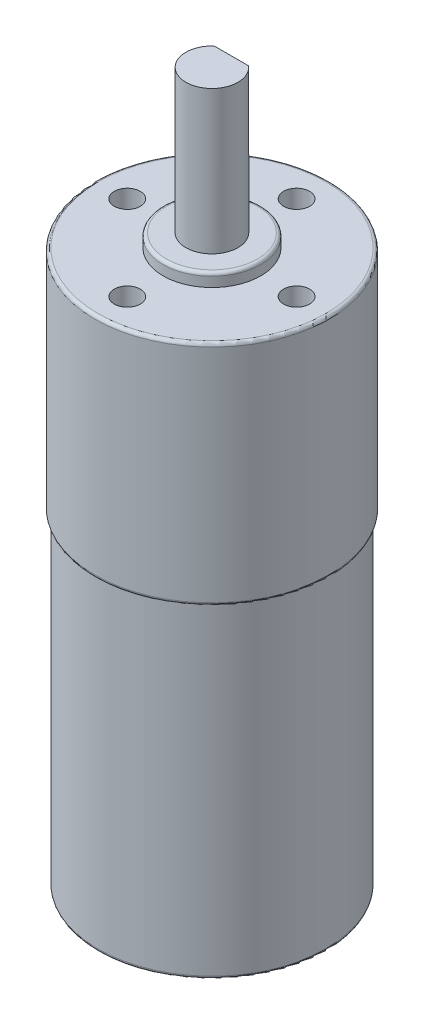
ISO-10303-21;
HEADER;
FILE_DESCRIPTION(('STEP AP214'),'2;1');
FILE_NAME('part.step','',(''),(''),'','','');
FILE_SCHEMA(('AUTOMOTIVE_DESIGN { 1 0 10303 214 1 1 1 1 }'));
ENDSEC;
DATA;
#1=APPLICATION_CONTEXT('core data for automotive mechanical design processes');
#2=APPLICATION_PROTOCOL_DEFINITION('international standard','automotive_design',2000,#1);
#3=PRODUCT_CONTEXT('',#1,'mechanical');
#4=PRODUCT('Part','Part','',(#3));
#5=PRODUCT_RELATED_PRODUCT_CATEGORY('part','',(#4));
#6=PRODUCT_DEFINITION_FORMATION('','',#4);
#7=PRODUCT_DEFINITION_CONTEXT('part definition',#1,'design');
#8=PRODUCT_DEFINITION('design','',#6,#7);
#9=PRODUCT_DEFINITION_SHAPE('','',#8);
#10=(LENGTH_UNIT() NAMED_UNIT(*) SI_UNIT(.MILLI.,.METRE.));
#11=(NAMED_UNIT(*) PLANE_ANGLE_UNIT() SI_UNIT($,.RADIAN.));
#12=(NAMED_UNIT(*) SI_UNIT($,.STERADIAN.) SOLID_ANGLE_UNIT());
#13=UNCERTAINTY_MEASURE_WITH_UNIT(LENGTH_MEASURE(1.E-05),#10,'distance_accuracy_value','');
#14=(GEOMETRIC_REPRESENTATION_CONTEXT(3) GLOBAL_UNCERTAINTY_ASSIGNED_CONTEXT((#13)) GLOBAL_UNIT_ASSIGNED_CONTEXT((#10,
#11,#12)) REPRESENTATION_CONTEXT('',''));
#15=CARTESIAN_POINT('',(0.,0.,0.));
#16=DIRECTION('',(0.,0.,1.));
#17=DIRECTION('',(1.,0.,0.));
#18=AXIS2_PLACEMENT_3D('',#15,#16,#17);
#19=CARTESIAN_POINT('',(0.,87.,0.));
#20=DIRECTION('',(0.,1.,0.));
#21=DIRECTION('',(0.,0.,1.));
#22=AXIS2_PLACEMENT_3D('',#19,#20,#21);
#23=PLANE('',#22);
#24=CARTESIAN_POINT('',(0.,87.,0.));
#25=DIRECTION('',(0.,1.,0.));
#26=DIRECTION('',(0.,0.,1.));
#27=AXIS2_PLACEMENT_3D('',#24,#25,#26);
#28=CIRCLE('',#27,7.);
#29=CARTESIAN_POINT('',(0.,87.,7.));
#30=VERTEX_POINT('',#29);
#31=EDGE_CURVE('E45',#30,#30,#28,.T.);
#32=ORIENTED_EDGE('',*,*,#31,.T.);
#33=EDGE_LOOP('',(#32));
#34=FACE_BOUND('',#33,.T.);
#35=CARTESIAN_POINT('',(0.,87.,0.));
#36=DIRECTION('',(0.,1.,0.));
#37=DIRECTION('',(0.,0.,1.));
#38=AXIS2_PLACEMENT_3D('',#35,#36,#37);
#39=CIRCLE('',#38,4.);
#40=CARTESIAN_POINT('',(0.,87.,4.));
#41=VERTEX_POINT('',#40);
#42=EDGE_CURVE('E80',#41,#41,#39,.T.);
#43=ORIENTED_EDGE('',*,*,#42,.F.);
#44=EDGE_LOOP('',(#43));
#45=FACE_BOUND('',#44,.T.);
#46=ADVANCED_FACE('F37',(#34,#45),#23,.T.);
#47=CARTESIAN_POINT('',(0.,85.,0.));
#48=DIRECTION('',(0.,1.,0.));
#49=DIRECTION('',(0.,0.,1.));
#50=AXIS2_PLACEMENT_3D('',#47,#48,#49);
#51=PLANE('',#50);
#52=CARTESIAN_POINT('',(0.,85.,0.));
#53=DIRECTION('',(0.,1.,0.));
#54=DIRECTION('',(0.,0.,1.));
#55=AXIS2_PLACEMENT_3D('',#52,#53,#54);
#56=CIRCLE('',#55,17.5);
#57=CARTESIAN_POINT('',(0.,85.,17.5));
#58=VERTEX_POINT('',#57);
#59=EDGE_CURVE('E94',#58,#58,#56,.T.);
#60=ORIENTED_EDGE('',*,*,#59,.T.);
#61=EDGE_LOOP('',(#60));
#62=FACE_BOUND('',#61,.T.);
#63=CARTESIAN_POINT('',(-12.9999999999996,85.,3.69482222595252E-13));
#64=DIRECTION('',(0.,1.,0.));
#65=DIRECTION('',(0.,0.,1.));
#66=AXIS2_PLACEMENT_3D('',#63,#64,#65);
#67=CIRCLE('',#66,2.00000000000059);
#68=CARTESIAN_POINT('',(-12.9999999999996,85.,2.00000000000096));
#69=VERTEX_POINT('',#68);
#70=EDGE_CURVE('E169',#69,#69,#67,.T.);
#71=ORIENTED_EDGE('',*,*,#70,.F.);
#72=EDGE_LOOP('',(#71));
#73=FACE_BOUND('',#72,.T.);
#74=CARTESIAN_POINT('',(7.35780363512721E-13,85.,13.));
#75=DIRECTION('',(0.,1.,0.));
#76=DIRECTION('',(0.,0.,1.));
#77=AXIS2_PLACEMENT_3D('',#74,#75,#76);
#78=CIRCLE('',#77,2.00000000000079);
#79=CARTESIAN_POINT('',(7.35780363512721E-13,85.,15.0000000000008));
#80=VERTEX_POINT('',#79);
#81=EDGE_CURVE('E173',#80,#80,#78,.T.);
#82=ORIENTED_EDGE('',*,*,#81,.F.);
#83=EDGE_LOOP('',(#82));
#84=FACE_BOUND('',#83,.T.);
#85=CARTESIAN_POINT('',(13.0000000000004,85.,-3.6789018175636E-13));
#86=DIRECTION('',(0.,1.,0.));
#87=DIRECTION('',(0.,0.,1.));
#88=AXIS2_PLACEMENT_3D('',#85,#86,#87);
#89=CIRCLE('',#88,2.00000000000029);
#90=CARTESIAN_POINT('',(13.0000000000004,85.,1.99999999999992));
#91=VERTEX_POINT('',#90);
#92=EDGE_CURVE('E177',#91,#91,#89,.T.);
#93=ORIENTED_EDGE('',*,*,#92,.F.);
#94=EDGE_LOOP('',(#93));
#95=FACE_BOUND('',#94,.T.);
#96=CARTESIAN_POINT('',(0.,85.,-13.));
#97=DIRECTION('',(0.,1.,0.));
#98=DIRECTION('',(0.,0.,1.));
#99=AXIS2_PLACEMENT_3D('',#96,#97,#98);
#100=CIRCLE('',#99,2.);
#101=CARTESIAN_POINT('',(0.,85.,-11.));
#102=VERTEX_POINT('',#101);
#103=EDGE_CURVE('E88',#102,#102,#100,.T.);
#104=ORIENTED_EDGE('',*,*,#103,.F.);
#105=EDGE_LOOP('',(#104));
#106=FACE_BOUND('',#105,.T.);
#107=CARTESIAN_POINT('',(0.,85.,0.));
#108=DIRECTION('',(0.,1.,0.));
#109=DIRECTION('',(0.,0.,1.));
#110=AXIS2_PLACEMENT_3D('',#107,#108,#109);
#111=CIRCLE('',#110,7.5);
#112=CARTESIAN_POINT('',(0.,85.,7.5));
#113=VERTEX_POINT('',#112);
#114=EDGE_CURVE('E79',#113,#113,#111,.T.);
#115=ORIENTED_EDGE('',*,*,#114,.F.);
#116=EDGE_LOOP('',(#115));
#117=FACE_BOUND('',#116,.T.);
#118=ADVANCED_FACE('F123',(#62,#73,#84,#95,#106,#117),#51,.T.);
#119=CARTESIAN_POINT('',(0.,50.,0.));
#120=DIRECTION('',(0.,-1.,0.));
#121=DIRECTION('',(0.,0.,-1.));
#122=AXIS2_PLACEMENT_3D('',#119,#120,#121);
#123=CYLINDRICAL_SURFACE('',#122,17.5);
#124=CARTESIAN_POINT('',(0.,0.5,0.));
#125=DIRECTION('',(0.,1.,0.));
#126=DIRECTION('',(0.,0.,1.));
#127=AXIS2_PLACEMENT_3D('',#124,#125,#126);
#128=CIRCLE('',#127,17.5);
#129=CARTESIAN_POINT('',(0.,0.5,17.5));
#130=VERTEX_POINT('',#129);
#131=EDGE_CURVE('E103',#130,#130,#128,.T.);
#132=ORIENTED_EDGE('',*,*,#131,.T.);
#133=EDGE_LOOP('',(#132));
#134=FACE_BOUND('',#133,.T.);
#135=CARTESIAN_POINT('',(0.,50.,0.));
#136=DIRECTION('',(0.,1.,0.));
#137=DIRECTION('',(0.,0.,1.));
#138=AXIS2_PLACEMENT_3D('',#135,#136,#137);
#139=CIRCLE('',#138,17.5);
#140=CARTESIAN_POINT('',(0.,50.,17.5));
#141=VERTEX_POINT('',#140);
#142=EDGE_CURVE('E69',#141,#141,#139,.T.);
#143=ORIENTED_EDGE('',*,*,#142,.F.);
#144=EDGE_LOOP('',(#143));
#145=FACE_BOUND('',#144,.T.);
#146=ADVANCED_FACE('F130',(#134,#145),#123,.T.);
#147=CARTESIAN_POINT('',(0.,0.,0.));
#148=DIRECTION('',(0.,1.,0.));
#149=DIRECTION('',(0.,0.,1.));
#150=AXIS2_PLACEMENT_3D('',#147,#148,#149);
#151=PLANE('',#150);
#152=CARTESIAN_POINT('',(0.,0.,0.));
#153=DIRECTION('',(0.,1.,0.));
#154=DIRECTION('',(0.,0.,1.));
#155=AXIS2_PLACEMENT_3D('',#152,#153,#154);
#156=CIRCLE('',#155,17.);
#157=CARTESIAN_POINT('',(0.,0.,17.));
#158=VERTEX_POINT('',#157);
#159=EDGE_CURVE('E106',#158,#158,#156,.F.);
#160=ORIENTED_EDGE('',*,*,#159,.T.);
#161=EDGE_LOOP('',(#160));
#162=FACE_BOUND('',#161,.T.);
#163=ADVANCED_FACE('F142',(#162),#151,.F.);
#164=CARTESIAN_POINT('',(0.,85.,0.));
#165=DIRECTION('',(0.,-1.,0.));
#166=DIRECTION('',(0.,0.,-1.));
#167=AXIS2_PLACEMENT_3D('',#164,#165,#166);
#168=CYLINDRICAL_SURFACE('',#167,18.);
#169=CARTESIAN_POINT('',(0.,50.5,0.));
#170=DIRECTION('',(0.,1.,0.));
#171=DIRECTION('',(0.,0.,1.));
#172=AXIS2_PLACEMENT_3D('',#169,#170,#171);
#173=CIRCLE('',#172,18.);
#174=CARTESIAN_POINT('',(0.,50.5,18.));
#175=VERTEX_POINT('',#174);
#176=EDGE_CURVE('E100',#175,#175,#173,.T.);
#177=ORIENTED_EDGE('',*,*,#176,.T.);
#178=EDGE_LOOP('',(#177));
#179=FACE_BOUND('',#178,.T.);
#180=CARTESIAN_POINT('',(0.,84.5,0.));
#181=DIRECTION('',(0.,1.,0.));
#182=DIRECTION('',(0.,0.,1.));
#183=AXIS2_PLACEMENT_3D('',#180,#181,#182);
#184=CIRCLE('',#183,18.);
#185=CARTESIAN_POINT('',(0.,84.5,18.));
#186=VERTEX_POINT('',#185);
#187=EDGE_CURVE('E97',#186,#186,#184,.F.);
#188=ORIENTED_EDGE('',*,*,#187,.T.);
#189=EDGE_LOOP('',(#188));
#190=FACE_BOUND('',#189,.T.);
#191=ADVANCED_FACE('F137',(#179,#190),#168,.T.);
#192=CARTESIAN_POINT('',(0.,87.,0.));
#193=DIRECTION('',(0.,-1.,0.));
#194=DIRECTION('',(0.,0.,-1.));
#195=AXIS2_PLACEMENT_3D('',#192,#193,#194);
#196=CYLINDRICAL_SURFACE('',#195,7.5);
#197=CARTESIAN_POINT('',(0.,86.5,0.));
#198=DIRECTION('',(0.,1.,0.));
#199=DIRECTION('',(0.,0.,1.));
#200=AXIS2_PLACEMENT_3D('',#197,#198,#199);
#201=CIRCLE('',#200,7.5);
#202=CARTESIAN_POINT('',(0.,86.5,7.5));
#203=VERTEX_POINT('',#202);
#204=EDGE_CURVE('E11',#203,#203,#201,.F.);
#205=ORIENTED_EDGE('',*,*,#204,.T.);
#206=EDGE_LOOP('',(#205));
#207=FACE_BOUND('',#206,.T.);
#208=ORIENTED_EDGE('',*,*,#114,.T.);
#209=EDGE_LOOP('',(#208));
#210=FACE_BOUND('',#209,.T.);
#211=ADVANCED_FACE('F136',(#207,#210),#196,.T.);
#212=CARTESIAN_POINT('',(0.,109.,0.));
#213=DIRECTION('',(0.,-1.,0.));
#214=DIRECTION('',(0.,0.,-1.));
#215=AXIS2_PLACEMENT_3D('',#212,#213,#214);
#216=CYLINDRICAL_SURFACE('',#215,4.);
#217=CARTESIAN_POINT('',(0.,109.,0.));
#218=DIRECTION('',(0.,1.,0.));
#219=DIRECTION('',(0.,0.,1.));
#220=AXIS2_PLACEMENT_3D('',#217,#218,#219);
#221=CIRCLE('',#220,4.);
#222=CARTESIAN_POINT('',(-2.64575131106459,109.,-3.));
#223=VERTEX_POINT('',#222);
#224=CARTESIAN_POINT('',(2.64575131106459,109.,-3.));
#225=VERTEX_POINT('',#224);
#226=EDGE_CURVE('E75',#223,#225,#221,.T.);
#227=ORIENTED_EDGE('',*,*,#226,.F.);
#228=DIRECTION('',(0.,-1.,0.));
#229=VECTOR('',#228,1.);
#230=CARTESIAN_POINT('',(-2.64575131106459,109.,-3.));
#231=LINE('',#230,#229);
#232=CARTESIAN_POINT('',(-2.64575131106459,91.,-3.));
#233=VERTEX_POINT('',#232);
#234=EDGE_CURVE('E52',#223,#233,#231,.T.);
#235=ORIENTED_EDGE('',*,*,#234,.T.);
#236=CARTESIAN_POINT('',(0.,91.,0.));
#237=DIRECTION('',(0.,1.,0.));
#238=DIRECTION('',(0.,0.,1.));
#239=AXIS2_PLACEMENT_3D('',#236,#237,#238);
#240=CIRCLE('',#239,4.);
#241=CARTESIAN_POINT('',(2.64575131106459,91.,-3.));
#242=VERTEX_POINT('',#241);
#243=EDGE_CURVE('E68',#242,#233,#240,.T.);
#244=ORIENTED_EDGE('',*,*,#243,.F.);
#245=DIRECTION('',(0.,-1.,0.));
#246=VECTOR('',#245,1.);
#247=CARTESIAN_POINT('',(2.64575131106459,109.,-3.));
#248=LINE('',#247,#246);
#249=EDGE_CURVE('E57',#242,#225,#248,.F.);
#250=ORIENTED_EDGE('',*,*,#249,.T.);
#251=EDGE_LOOP('',(#227,#235,#244,#250));
#252=FACE_BOUND('',#251,.T.);
#253=ORIENTED_EDGE('',*,*,#42,.T.);
#254=EDGE_LOOP('',(#253));
#255=FACE_BOUND('',#254,.T.);
#256=ADVANCED_FACE('F73',(#252,#255),#216,.T.);
#257=CARTESIAN_POINT('',(0.,109.,0.));
#258=DIRECTION('',(0.,1.,0.));
#259=DIRECTION('',(0.,0.,1.));
#260=AXIS2_PLACEMENT_3D('',#257,#258,#259);
#261=PLANE('',#260);
#262=DIRECTION('',(1.,0.,0.));
#263=VECTOR('',#262,1.);
#264=CARTESIAN_POINT('',(0.,109.,-3.));
#265=LINE('',#264,#263);
#266=EDGE_CURVE('E63',#223,#225,#265,.T.);
#267=ORIENTED_EDGE('',*,*,#266,.F.);
#268=ORIENTED_EDGE('',*,*,#226,.T.);
#269=EDGE_LOOP('',(#267,#268));
#270=FACE_BOUND('',#269,.T.);
#271=ADVANCED_FACE('F78',(#270),#261,.T.);
#272=CARTESIAN_POINT('',(0.,80.,-13.));
#273=DIRECTION('',(0.,1.,0.));
#274=DIRECTION('',(0.,0.,1.));
#275=AXIS2_PLACEMENT_3D('',#272,#273,#274);
#276=CYLINDRICAL_SURFACE('',#275,2.);
#277=CARTESIAN_POINT('',(0.,80.,-13.));
#278=DIRECTION('',(0.,1.,0.));
#279=DIRECTION('',(0.,0.,1.));
#280=AXIS2_PLACEMENT_3D('',#277,#278,#279);
#281=CIRCLE('',#280,2.);
#282=CARTESIAN_POINT('',(0.,80.,-11.));
#283=VERTEX_POINT('',#282);
#284=EDGE_CURVE('E85',#283,#283,#281,.T.);
#285=ORIENTED_EDGE('',*,*,#284,.F.);
#286=EDGE_LOOP('',(#285));
#287=FACE_BOUND('',#286,.T.);
#288=ORIENTED_EDGE('',*,*,#103,.T.);
#289=EDGE_LOOP('',(#288));
#290=FACE_BOUND('',#289,.T.);
#291=ADVANCED_FACE('F236',(#287,#290),#276,.F.);
#292=CARTESIAN_POINT('',(0.,80.,-13.));
#293=DIRECTION('',(0.,1.,0.));
#294=DIRECTION('',(0.,0.,1.));
#295=AXIS2_PLACEMENT_3D('',#292,#293,#294);
#296=PLANE('',#295);
#297=ORIENTED_EDGE('',*,*,#284,.T.);
#298=EDGE_LOOP('',(#297));
#299=FACE_BOUND('',#298,.T.);
#300=ADVANCED_FACE('F232',(#299),#296,.T.);
#301=CARTESIAN_POINT('',(13.0000000000004,80.,-3.6789018175636E-13));
#302=DIRECTION('',(0.,1.,0.));
#303=DIRECTION('',(0.,0.,1.));
#304=AXIS2_PLACEMENT_3D('',#301,#302,#303);
#305=CYLINDRICAL_SURFACE('',#304,2.00000000000029);
#306=CARTESIAN_POINT('',(13.0000000000004,80.,-3.6789018175636E-13));
#307=DIRECTION('',(0.,1.,0.));
#308=DIRECTION('',(0.,0.,1.));
#309=AXIS2_PLACEMENT_3D('',#306,#307,#308);
#310=CIRCLE('',#309,2.00000000000029);
#311=CARTESIAN_POINT('',(13.0000000000004,80.,1.99999999999992));
#312=VERTEX_POINT('',#311);
#313=EDGE_CURVE('E184',#312,#312,#310,.T.);
#314=ORIENTED_EDGE('',*,*,#313,.F.);
#315=EDGE_LOOP('',(#314));
#316=FACE_BOUND('',#315,.T.);
#317=ORIENTED_EDGE('',*,*,#92,.T.);
#318=EDGE_LOOP('',(#317));
#319=FACE_BOUND('',#318,.T.);
#320=ADVANCED_FACE('F229',(#316,#319),#305,.F.);
#321=CARTESIAN_POINT('',(13.0000000000004,80.,-3.6789018175636E-13));
#322=DIRECTION('',(0.,1.,0.));
#323=DIRECTION('',(0.,0.,1.));
#324=AXIS2_PLACEMENT_3D('',#321,#322,#323);
#325=PLANE('',#324);
#326=ORIENTED_EDGE('',*,*,#313,.T.);
#327=EDGE_LOOP('',(#326));
#328=FACE_BOUND('',#327,.T.);
#329=ADVANCED_FACE('F225',(#328),#325,.T.);
#330=CARTESIAN_POINT('',(7.35780363512721E-13,80.,13.));
#331=DIRECTION('',(0.,1.,0.));
#332=DIRECTION('',(0.,0.,1.));
#333=AXIS2_PLACEMENT_3D('',#330,#331,#332);
#334=CYLINDRICAL_SURFACE('',#333,2.00000000000079);
#335=CARTESIAN_POINT('',(7.35780363512721E-13,80.,13.));
#336=DIRECTION('',(0.,1.,0.));
#337=DIRECTION('',(0.,0.,1.));
#338=AXIS2_PLACEMENT_3D('',#335,#336,#337);
#339=CIRCLE('',#338,2.00000000000079);
#340=CARTESIAN_POINT('',(7.35780363512721E-13,80.,15.0000000000008));
#341=VERTEX_POINT('',#340);
#342=EDGE_CURVE('E190',#341,#341,#339,.T.);
#343=ORIENTED_EDGE('',*,*,#342,.F.);
#344=EDGE_LOOP('',(#343));
#345=FACE_BOUND('',#344,.T.);
#346=ORIENTED_EDGE('',*,*,#81,.T.);
#347=EDGE_LOOP('',(#346));
#348=FACE_BOUND('',#347,.T.);
#349=ADVANCED_FACE('F221',(#345,#348),#334,.F.);
#350=CARTESIAN_POINT('',(7.35780363512721E-13,80.,13.));
#351=DIRECTION('',(0.,1.,0.));
#352=DIRECTION('',(0.,0.,1.));
#353=AXIS2_PLACEMENT_3D('',#350,#351,#352);
#354=PLANE('',#353);
#355=ORIENTED_EDGE('',*,*,#342,.T.);
#356=EDGE_LOOP('',(#355));
#357=FACE_BOUND('',#356,.T.);
#358=ADVANCED_FACE('F217',(#357),#354,.T.);
#359=CARTESIAN_POINT('',(-12.9999999999996,80.,3.69482222595252E-13));
#360=DIRECTION('',(0.,1.,0.));
#361=DIRECTION('',(0.,0.,1.));
#362=AXIS2_PLACEMENT_3D('',#359,#360,#361);
#363=CYLINDRICAL_SURFACE('',#362,2.00000000000059);
#364=CARTESIAN_POINT('',(-12.9999999999996,80.,3.69482222595252E-13));
#365=DIRECTION('',(0.,1.,0.));
#366=DIRECTION('',(0.,0.,1.));
#367=AXIS2_PLACEMENT_3D('',#364,#365,#366);
#368=CIRCLE('',#367,2.00000000000059);
#369=CARTESIAN_POINT('',(-12.9999999999996,80.,2.00000000000096));
#370=VERTEX_POINT('',#369);
#371=EDGE_CURVE('E194',#370,#370,#368,.T.);
#372=ORIENTED_EDGE('',*,*,#371,.F.);
#373=EDGE_LOOP('',(#372));
#374=FACE_BOUND('',#373,.T.);
#375=ORIENTED_EDGE('',*,*,#70,.T.);
#376=EDGE_LOOP('',(#375));
#377=FACE_BOUND('',#376,.T.);
#378=ADVANCED_FACE('F211',(#374,#377),#363,.F.);
#379=CARTESIAN_POINT('',(-12.9999999999996,80.,3.69482222595252E-13));
#380=DIRECTION('',(0.,1.,0.));
#381=DIRECTION('',(0.,0.,1.));
#382=AXIS2_PLACEMENT_3D('',#379,#380,#381);
#383=PLANE('',#382);
#384=ORIENTED_EDGE('',*,*,#371,.T.);
#385=EDGE_LOOP('',(#384));
#386=FACE_BOUND('',#385,.T.);
#387=ADVANCED_FACE('F204',(#386),#383,.T.);
#388=CARTESIAN_POINT('',(0.,91.,0.));
#389=DIRECTION('',(0.,1.,0.));
#390=DIRECTION('',(0.,0.,1.));
#391=AXIS2_PLACEMENT_3D('',#388,#389,#390);
#392=PLANE('',#391);
#393=ORIENTED_EDGE('',*,*,#243,.T.);
#394=DIRECTION('',(1.,0.,0.));
#395=VECTOR('',#394,1.);
#396=CARTESIAN_POINT('',(-4.44576170717249,91.,-3.));
#397=LINE('',#396,#395);
#398=EDGE_CURVE('E76',#233,#242,#397,.T.);
#399=ORIENTED_EDGE('',*,*,#398,.T.);
#400=EDGE_LOOP('',(#393,#399));
#401=FACE_BOUND('',#400,.T.);
#402=ADVANCED_FACE('F202',(#401),#392,.T.);
#403=CARTESIAN_POINT('',(-4.44576170717249,91.,-3.));
#404=DIRECTION('',(0.,0.,1.));
#405=DIRECTION('',(1.,0.,0.));
#406=AXIS2_PLACEMENT_3D('',#403,#404,#405);
#407=PLANE('',#406);
#408=ORIENTED_EDGE('',*,*,#266,.T.);
#409=ORIENTED_EDGE('',*,*,#249,.F.);
#410=ORIENTED_EDGE('',*,*,#398,.F.);
#411=ORIENTED_EDGE('',*,*,#234,.F.);
#412=EDGE_LOOP('',(#408,#409,#410,#411));
#413=FACE_BOUND('',#412,.T.);
#414=ADVANCED_FACE('F64',(#413),#407,.F.);
#415=CARTESIAN_POINT('',(0.,84.5,0.));
#416=DIRECTION('',(0.,1.,0.));
#417=DIRECTION('',(0.,0.,1.));
#418=AXIS2_PLACEMENT_3D('',#415,#416,#417);
#419=TOROIDAL_SURFACE('',#418,17.5,0.5);
#420=ORIENTED_EDGE('',*,*,#187,.F.);
#421=EDGE_LOOP('',(#420));
#422=FACE_BOUND('',#421,.T.);
#423=ORIENTED_EDGE('',*,*,#59,.F.);
#424=EDGE_LOOP('',(#423));
#425=FACE_BOUND('',#424,.T.);
#426=ADVANCED_FACE('F150',(#422,#425),#419,.T.);
#427=CARTESIAN_POINT('',(0.,50.5,0.));
#428=DIRECTION('',(0.,1.,0.));
#429=DIRECTION('',(0.,0.,1.));
#430=AXIS2_PLACEMENT_3D('',#427,#428,#429);
#431=TOROIDAL_SURFACE('',#430,17.5,0.5);
#432=ORIENTED_EDGE('',*,*,#142,.T.);
#433=EDGE_LOOP('',(#432));
#434=FACE_BOUND('',#433,.T.);
#435=ORIENTED_EDGE('',*,*,#176,.F.);
#436=EDGE_LOOP('',(#435));
#437=FACE_BOUND('',#436,.T.);
#438=ADVANCED_FACE('F119',(#434,#437),#431,.T.);
#439=CARTESIAN_POINT('',(0.,0.5,0.));
#440=DIRECTION('',(0.,1.,0.));
#441=DIRECTION('',(0.,0.,1.));
#442=AXIS2_PLACEMENT_3D('',#439,#440,#441);
#443=TOROIDAL_SURFACE('',#442,17.,0.5);
#444=ORIENTED_EDGE('',*,*,#159,.F.);
#445=EDGE_LOOP('',(#444));
#446=FACE_BOUND('',#445,.T.);
#447=ORIENTED_EDGE('',*,*,#131,.F.);
#448=EDGE_LOOP('',(#447));
#449=FACE_BOUND('',#448,.T.);
#450=ADVANCED_FACE('F114',(#446,#449),#443,.T.);
#451=CARTESIAN_POINT('',(0.,86.5,0.));
#452=DIRECTION('',(0.,1.,0.));
#453=DIRECTION('',(0.,0.,1.));
#454=AXIS2_PLACEMENT_3D('',#451,#452,#453);
#455=TOROIDAL_SURFACE('',#454,7.,0.5);
#456=ORIENTED_EDGE('',*,*,#204,.F.);
#457=EDGE_LOOP('',(#456));
#458=FACE_BOUND('',#457,.T.);
#459=ORIENTED_EDGE('',*,*,#31,.F.);
#460=EDGE_LOOP('',(#459));
#461=FACE_BOUND('',#460,.T.);
#462=ADVANCED_FACE('F39',(#458,#461),#455,.T.);
#463=CLOSED_SHELL('',(#46,#118,#146,#163,#191,#211,#256,#271,#291,#300,#320,#329,#349,#358,#378,
#387,#402,#414,#426,#438,#450,#462));
#464=MANIFOLD_SOLID_BREP('B2',#463);
#465=ADVANCED_BREP_SHAPE_REPRESENTATION('',(#18,#464),#14);
#466=SHAPE_DEFINITION_REPRESENTATION(#9,#465);
ENDSEC;
END-ISO-10303-21;
